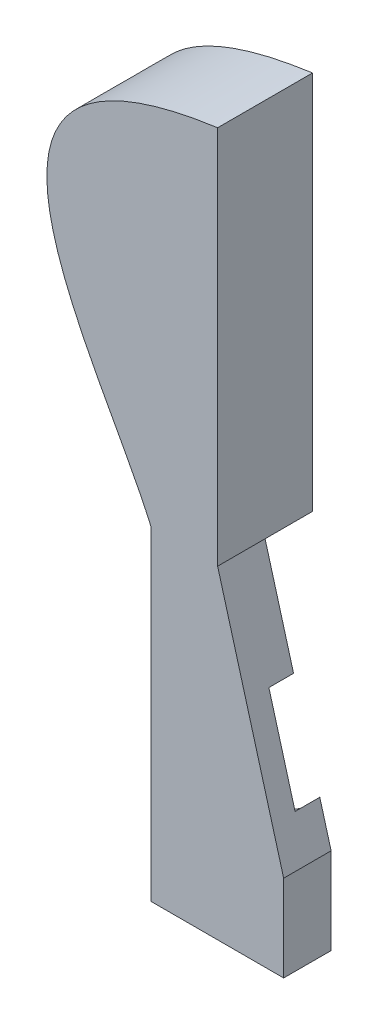
ISO-10303-21;
HEADER;
FILE_DESCRIPTION(('STEP AP214'),'2;1');
FILE_NAME('part.step','',(''),(''),'','','');
FILE_SCHEMA(('AUTOMOTIVE_DESIGN { 1 0 10303 214 1 1 1 1 }'));
ENDSEC;
DATA;
#1=APPLICATION_CONTEXT('core data for automotive mechanical design processes');
#2=APPLICATION_PROTOCOL_DEFINITION('international standard','automotive_design',2000,#1);
#3=PRODUCT_CONTEXT('',#1,'mechanical');
#4=PRODUCT('Part','Part','',(#3));
#5=PRODUCT_RELATED_PRODUCT_CATEGORY('part','',(#4));
#6=PRODUCT_DEFINITION_FORMATION('','',#4);
#7=PRODUCT_DEFINITION_CONTEXT('part definition',#1,'design');
#8=PRODUCT_DEFINITION('design','',#6,#7);
#9=PRODUCT_DEFINITION_SHAPE('','',#8);
#10=(LENGTH_UNIT() NAMED_UNIT(*) SI_UNIT(.MILLI.,.METRE.));
#11=(NAMED_UNIT(*) PLANE_ANGLE_UNIT() SI_UNIT($,.RADIAN.));
#12=(NAMED_UNIT(*) SI_UNIT($,.STERADIAN.) SOLID_ANGLE_UNIT());
#13=UNCERTAINTY_MEASURE_WITH_UNIT(LENGTH_MEASURE(1.E-05),#10,'distance_accuracy_value','');
#14=(GEOMETRIC_REPRESENTATION_CONTEXT(3) GLOBAL_UNCERTAINTY_ASSIGNED_CONTEXT((#13)) GLOBAL_UNIT_ASSIGNED_CONTEXT((#10,
#11,#12)) REPRESENTATION_CONTEXT('',''));
#15=CARTESIAN_POINT('',(0.,0.,0.));
#16=DIRECTION('',(0.,0.,1.));
#17=DIRECTION('',(1.,0.,0.));
#18=AXIS2_PLACEMENT_3D('',#15,#16,#17);
#19=CARTESIAN_POINT('',(0.220726200140617,284.828286352385,50.));
#20=CARTESIAN_POINT('',(-159.978737061135,262.606607754272,50.));
#21=CARTESIAN_POINT('',(-63.0007246030179,150.139017080568,50.));
#22=CARTESIAN_POINT('',(-35.,85.6249999999999,50.));
#23=B_SPLINE_CURVE_WITH_KNOTS('',3,(#19,#20,#21,#22),.UNSPECIFIED.,.F.,.F.,(4,4),(0.,1.),.UNSPECIFIED.);
#24=DIRECTION('',(0.,0.,-1.));
#25=VECTOR('',#24,1.);
#26=SURFACE_OF_LINEAR_EXTRUSION('',#23,#25);
#27=CARTESIAN_POINT('',(0.220726200140617,284.828286352385,0.));
#28=CARTESIAN_POINT('',(-159.978737061135,262.606607754272,0.));
#29=CARTESIAN_POINT('',(-63.0007246030179,150.139017080568,0.));
#30=CARTESIAN_POINT('',(-35.,85.6249999999999,0.));
#31=B_SPLINE_CURVE_WITH_KNOTS('',3,(#27,#28,#29,#30),.UNSPECIFIED.,.F.,.F.,(4,4),(0.,1.),.UNSPECIFIED.);
#32=CARTESIAN_POINT('',(0.220726200140617,284.828286352385,0.));
#33=VERTEX_POINT('',#32);
#34=CARTESIAN_POINT('',(-35.,85.6249999999999,0.));
#35=VERTEX_POINT('',#34);
#36=EDGE_CURVE('E140',#33,#35,#31,.T.);
#37=ORIENTED_EDGE('',*,*,#36,.T.);
#38=DIRECTION('',(0.,0.,-1.));
#39=VECTOR('',#38,1.);
#40=CARTESIAN_POINT('',(-35.,85.6249999999999,50.));
#41=LINE('',#40,#39);
#42=CARTESIAN_POINT('',(-35.,85.6249999999999,50.));
#43=VERTEX_POINT('',#42);
#44=EDGE_CURVE('E186',#43,#35,#41,.T.);
#45=ORIENTED_EDGE('',*,*,#44,.F.);
#46=CARTESIAN_POINT('',(0.220726200140617,284.828286352385,50.));
#47=VERTEX_POINT('',#46);
#48=EDGE_CURVE('E141',#47,#43,#23,.T.);
#49=ORIENTED_EDGE('',*,*,#48,.F.);
#50=DIRECTION('',(0.,0.,-1.));
#51=VECTOR('',#50,1.);
#52=CARTESIAN_POINT('',(0.220726200140617,284.828286352385,50.));
#53=LINE('',#52,#51);
#54=EDGE_CURVE('E161',#47,#33,#53,.T.);
#55=ORIENTED_EDGE('',*,*,#54,.T.);
#56=EDGE_LOOP('',(#37,#45,#49,#55));
#57=FACE_BOUND('',#56,.T.);
#58=ADVANCED_FACE('F33',(#57),#26,.F.);
#59=CARTESIAN_POINT('',(-35.,-85.6249999999999,50.));
#60=DIRECTION('',(1.,0.,0.));
#61=DIRECTION('',(0.,0.,-1.));
#62=AXIS2_PLACEMENT_3D('',#59,#60,#61);
#63=PLANE('',#62);
#64=DIRECTION('',(0.,0.,1.));
#65=VECTOR('',#64,1.);
#66=CARTESIAN_POINT('',(-35.,75.0232065963302,50.));
#67=LINE('',#66,#65);
#68=CARTESIAN_POINT('',(-35.,75.0232065963301,0.));
#69=VERTEX_POINT('',#68);
#70=CARTESIAN_POINT('',(-35.,75.0232065963302,25.));
#71=VERTEX_POINT('',#70);
#72=EDGE_CURVE('E56',#69,#71,#67,.T.);
#73=ORIENTED_EDGE('',*,*,#72,.T.);
#74=DIRECTION('',(0.,-1.,0.));
#75=VECTOR('',#74,1.);
#76=CARTESIAN_POINT('',(-35.,-85.6249999999999,25.));
#77=LINE('',#76,#75);
#78=CARTESIAN_POINT('',(-35.,-85.6249999999999,25.));
#79=VERTEX_POINT('',#78);
#80=EDGE_CURVE('E138',#71,#79,#77,.T.);
#81=ORIENTED_EDGE('',*,*,#80,.T.);
#82=DIRECTION('',(0.,0.,-1.));
#83=VECTOR('',#82,1.);
#84=CARTESIAN_POINT('',(-35.,-85.6249999999999,50.));
#85=LINE('',#84,#83);
#86=CARTESIAN_POINT('',(-35.,-85.6249999999999,50.));
#87=VERTEX_POINT('',#86);
#88=EDGE_CURVE('E183',#87,#79,#85,.T.);
#89=ORIENTED_EDGE('',*,*,#88,.F.);
#90=DIRECTION('',(0.,-1.,0.));
#91=VECTOR('',#90,1.);
#92=CARTESIAN_POINT('',(-35.,-85.6249999999999,50.));
#93=LINE('',#92,#91);
#94=EDGE_CURVE('E147',#43,#87,#93,.T.);
#95=ORIENTED_EDGE('',*,*,#94,.F.);
#96=ORIENTED_EDGE('',*,*,#44,.T.);
#97=DIRECTION('',(0.,-1.,0.));
#98=VECTOR('',#97,1.);
#99=CARTESIAN_POINT('',(-35.,-85.6249999999999,0.));
#100=LINE('',#99,#98);
#101=EDGE_CURVE('E166',#35,#69,#100,.T.);
#102=ORIENTED_EDGE('',*,*,#101,.T.);
#103=EDGE_LOOP('',(#73,#81,#89,#95,#96,#102));
#104=FACE_BOUND('',#103,.T.);
#105=ADVANCED_FACE('F214',(#104),#63,.F.);
#106=CARTESIAN_POINT('',(35.,-85.6249999999999,50.));
#107=DIRECTION('',(0.,1.,0.));
#108=DIRECTION('',(0.,0.,1.));
#109=AXIS2_PLACEMENT_3D('',#106,#107,#108);
#110=PLANE('',#109);
#111=ORIENTED_EDGE('',*,*,#88,.T.);
#112=DIRECTION('',(1.,0.,0.));
#113=VECTOR('',#112,1.);
#114=CARTESIAN_POINT('',(35.,-85.6249999999999,25.));
#115=LINE('',#114,#113);
#116=CARTESIAN_POINT('',(35.,-85.6249999999999,25.));
#117=VERTEX_POINT('',#116);
#118=EDGE_CURVE('E135',#79,#117,#115,.T.);
#119=ORIENTED_EDGE('',*,*,#118,.T.);
#120=DIRECTION('',(0.,0.,-1.));
#121=VECTOR('',#120,1.);
#122=CARTESIAN_POINT('',(35.,-85.6249999999999,50.));
#123=LINE('',#122,#121);
#124=CARTESIAN_POINT('',(35.,-85.6249999999999,50.));
#125=VERTEX_POINT('',#124);
#126=EDGE_CURVE('E180',#125,#117,#123,.T.);
#127=ORIENTED_EDGE('',*,*,#126,.F.);
#128=DIRECTION('',(1.,0.,0.));
#129=VECTOR('',#128,1.);
#130=CARTESIAN_POINT('',(35.,-85.6249999999999,50.));
#131=LINE('',#130,#129);
#132=EDGE_CURVE('E153',#87,#125,#131,.T.);
#133=ORIENTED_EDGE('',*,*,#132,.F.);
#134=EDGE_LOOP('',(#111,#119,#127,#133));
#135=FACE_BOUND('',#134,.T.);
#136=ADVANCED_FACE('F210',(#135),#110,.F.);
#137=CARTESIAN_POINT('',(35.,-40.1019375,50.));
#138=DIRECTION('',(-1.,0.,0.));
#139=DIRECTION('',(0.,0.,1.));
#140=AXIS2_PLACEMENT_3D('',#137,#138,#139);
#141=PLANE('',#140);
#142=ORIENTED_EDGE('',*,*,#126,.T.);
#143=DIRECTION('',(0.,1.,0.));
#144=VECTOR('',#143,1.);
#145=CARTESIAN_POINT('',(35.,-40.1019375,25.));
#146=LINE('',#145,#144);
#147=CARTESIAN_POINT('',(35.,-40.1019375,25.));
#148=VERTEX_POINT('',#147);
#149=EDGE_CURVE('E132',#117,#148,#146,.T.);
#150=ORIENTED_EDGE('',*,*,#149,.T.);
#151=DIRECTION('',(0.,0.,-1.));
#152=VECTOR('',#151,1.);
#153=CARTESIAN_POINT('',(35.,-40.1019375,50.));
#154=LINE('',#153,#152);
#155=CARTESIAN_POINT('',(35.,-40.1019375,50.));
#156=VERTEX_POINT('',#155);
#157=EDGE_CURVE('E178',#156,#148,#154,.T.);
#158=ORIENTED_EDGE('',*,*,#157,.F.);
#159=DIRECTION('',(0.,1.,0.));
#160=VECTOR('',#159,1.);
#161=CARTESIAN_POINT('',(35.,-40.1019375,50.));
#162=LINE('',#161,#160);
#163=EDGE_CURVE('E155',#125,#156,#162,.T.);
#164=ORIENTED_EDGE('',*,*,#163,.F.);
#165=EDGE_LOOP('',(#142,#150,#158,#164));
#166=FACE_BOUND('',#165,.T.);
#167=ADVANCED_FACE('F207',(#166),#141,.F.);
#168=CARTESIAN_POINT('',(0.221790000790527,84.8282863552137,50.));
#169=DIRECTION('',(-0.963367879663412,-0.268183385825488,0.));
#170=DIRECTION('',(0.268183385825488,-0.963367879663412,0.));
#171=AXIS2_PLACEMENT_3D('',#168,#169,#170);
#172=PLANE('',#171);
#173=DIRECTION('',(0.268183385825488,-0.963367879663412,0.));
#174=VECTOR('',#173,1.);
#175=CARTESIAN_POINT('',(0.221790000790527,84.8282863552137,38.));
#176=LINE('',#175,#174);
#177=CARTESIAN_POINT('',(15.2169204209926,30.9628056367827,38.));
#178=VERTEX_POINT('',#177);
#179=CARTESIAN_POINT('',(29.0271028135332,-18.6461068926618,38.));
#180=VERTEX_POINT('',#179);
#181=EDGE_CURVE('E11',#178,#180,#176,.T.);
#182=ORIENTED_EDGE('',*,*,#181,.F.);
#183=DIRECTION('',(0.,0.,-1.));
#184=VECTOR('',#183,1.);
#185=CARTESIAN_POINT('',(15.2169204209926,30.9628056367826,38.));
#186=LINE('',#185,#184);
#187=CARTESIAN_POINT('',(15.2169204209926,30.9628056367826,25.));
#188=VERTEX_POINT('',#187);
#189=EDGE_CURVE('E106',#178,#188,#186,.T.);
#190=ORIENTED_EDGE('',*,*,#189,.T.);
#191=DIRECTION('',(0.268183385825487,-0.963367879663412,0.));
#192=VECTOR('',#191,1.);
#193=CARTESIAN_POINT('',(0.221790000790537,84.8282863552137,25.));
#194=LINE('',#193,#192);
#195=CARTESIAN_POINT('',(0.221790000790537,84.8282863552137,25.));
#196=VERTEX_POINT('',#195);
#197=EDGE_CURVE('E127',#196,#188,#194,.T.);
#198=ORIENTED_EDGE('',*,*,#197,.F.);
#199=DIRECTION('',(0.,0.,-1.));
#200=VECTOR('',#199,1.);
#201=CARTESIAN_POINT('',(0.221790000790527,84.8282863552137,50.));
#202=LINE('',#201,#200);
#203=CARTESIAN_POINT('',(0.221790000790527,84.8282863552137,50.));
#204=VERTEX_POINT('',#203);
#205=EDGE_CURVE('E175',#204,#196,#202,.T.);
#206=ORIENTED_EDGE('',*,*,#205,.F.);
#207=DIRECTION('',(-0.268183385825488,0.963367879663412,0.));
#208=VECTOR('',#207,1.);
#209=CARTESIAN_POINT('',(0.221790000790527,84.8282863552137,50.));
#210=LINE('',#209,#208);
#211=EDGE_CURVE('E157',#156,#204,#210,.T.);
#212=ORIENTED_EDGE('',*,*,#211,.F.);
#213=ORIENTED_EDGE('',*,*,#157,.T.);
#214=CARTESIAN_POINT('',(29.0271028135332,-18.6461068926618,25.));
#215=VERTEX_POINT('',#214);
#216=EDGE_CURVE('E122',#215,#148,#194,.T.);
#217=ORIENTED_EDGE('',*,*,#216,.F.);
#218=DIRECTION('',(0.,0.,-1.));
#219=VECTOR('',#218,1.);
#220=CARTESIAN_POINT('',(29.0271028135332,-18.6461068926618,38.));
#221=LINE('',#220,#219);
#222=EDGE_CURVE('E48',#215,#180,#221,.F.);
#223=ORIENTED_EDGE('',*,*,#222,.T.);
#224=EDGE_LOOP('',(#182,#190,#198,#206,#212,#213,#217,#223));
#225=FACE_BOUND('',#224,.T.);
#226=ADVANCED_FACE('F119',(#225),#172,.F.);
#227=CARTESIAN_POINT('',(0.221790000790527,84.8282863552137,50.));
#228=DIRECTION('',(-0.999999999985854,-5.31900324955009E-06,0.));
#229=DIRECTION('',(5.31900324955009E-06,-0.999999999985854,0.));
#230=AXIS2_PLACEMENT_3D('',#227,#228,#229);
#231=PLANE('',#230);
#232=DIRECTION('',(-5.31900324955009E-06,0.999999999985854,0.));
#233=VECTOR('',#232,1.);
#234=CARTESIAN_POINT('',(0.221790000790527,84.8282863552137,0.));
#235=LINE('',#234,#233);
#236=CARTESIAN_POINT('',(0.221790000790537,84.8282863552137,0.));
#237=VERTEX_POINT('',#236);
#238=EDGE_CURVE('E148',#237,#33,#235,.T.);
#239=ORIENTED_EDGE('',*,*,#238,.T.);
#240=ORIENTED_EDGE('',*,*,#54,.F.);
#241=DIRECTION('',(-5.31900324955009E-06,0.999999999985854,0.));
#242=VECTOR('',#241,1.);
#243=CARTESIAN_POINT('',(0.221790000790527,84.8282863552137,50.));
#244=LINE('',#243,#242);
#245=EDGE_CURVE('E159',#204,#47,#244,.T.);
#246=ORIENTED_EDGE('',*,*,#245,.F.);
#247=ORIENTED_EDGE('',*,*,#205,.T.);
#248=DIRECTION('',(0.,0.,1.));
#249=VECTOR('',#248,1.);
#250=CARTESIAN_POINT('',(0.221790000790537,84.8282863552137,-41.3763691391845));
#251=LINE('',#250,#249);
#252=EDGE_CURVE('E114',#237,#196,#251,.T.);
#253=ORIENTED_EDGE('',*,*,#252,.F.);
#254=EDGE_LOOP('',(#239,#240,#246,#247,#253));
#255=FACE_BOUND('',#254,.T.);
#256=ADVANCED_FACE('F197',(#255),#231,.F.);
#257=CARTESIAN_POINT('',(-87.9647073490397,201.086270107113,50.));
#258=DIRECTION('',(0.,0.,-1.));
#259=DIRECTION('',(-1.,0.,0.));
#260=AXIS2_PLACEMENT_3D('',#257,#258,#259);
#261=PLANE('',#260);
#262=ORIENTED_EDGE('',*,*,#48,.T.);
#263=ORIENTED_EDGE('',*,*,#94,.T.);
#264=ORIENTED_EDGE('',*,*,#132,.T.);
#265=ORIENTED_EDGE('',*,*,#163,.T.);
#266=ORIENTED_EDGE('',*,*,#211,.T.);
#267=ORIENTED_EDGE('',*,*,#245,.T.);
#268=EDGE_LOOP('',(#262,#263,#264,#265,#266,#267));
#269=FACE_BOUND('',#268,.T.);
#270=ADVANCED_FACE('F202',(#269),#261,.F.);
#271=CARTESIAN_POINT('',(-87.9647073490397,201.086270107113,0.));
#272=DIRECTION('',(0.,0.,-1.));
#273=DIRECTION('',(-1.,0.,0.));
#274=AXIS2_PLACEMENT_3D('',#271,#272,#273);
#275=PLANE('',#274);
#276=DIRECTION('',(0.963367879663412,0.268183385825488,0.));
#277=VECTOR('',#276,1.);
#278=CARTESIAN_POINT('',(-51.5858024995493,70.4060330691039,0.));
#279=LINE('',#278,#277);
#280=EDGE_CURVE('E189',#69,#237,#279,.T.);
#281=ORIENTED_EDGE('',*,*,#280,.F.);
#282=ORIENTED_EDGE('',*,*,#101,.F.);
#283=ORIENTED_EDGE('',*,*,#36,.F.);
#284=ORIENTED_EDGE('',*,*,#238,.F.);
#285=EDGE_LOOP('',(#281,#282,#283,#284));
#286=FACE_BOUND('',#285,.T.);
#287=ADVANCED_FACE('F217',(#286),#275,.T.);
#288=CARTESIAN_POINT('',(-132.824758814397,47.7906450897407,25.));
#289=DIRECTION('',(0.,0.,1.));
#290=DIRECTION('',(1.,0.,0.));
#291=AXIS2_PLACEMENT_3D('',#288,#289,#290);
#292=PLANE('',#291);
#293=ORIENTED_EDGE('',*,*,#197,.T.);
#294=CARTESIAN_POINT('',(0.,0.,25.));
#295=DIRECTION('',(0.,0.,1.));
#296=DIRECTION('',(1.,0.,0.));
#297=AXIS2_PLACEMENT_3D('',#294,#295,#296);
#298=CIRCLE('',#297,34.5);
#299=EDGE_CURVE('E41',#188,#215,#298,.T.);
#300=ORIENTED_EDGE('',*,*,#299,.T.);
#301=ORIENTED_EDGE('',*,*,#216,.T.);
#302=ORIENTED_EDGE('',*,*,#149,.F.);
#303=ORIENTED_EDGE('',*,*,#118,.F.);
#304=ORIENTED_EDGE('',*,*,#80,.F.);
#305=DIRECTION('',(0.963367879663412,0.268183385825488,0.));
#306=VECTOR('',#305,1.);
#307=CARTESIAN_POINT('',(-132.824758814397,47.7906450897407,25.));
#308=LINE('',#307,#306);
#309=EDGE_CURVE('E129',#71,#196,#308,.T.);
#310=ORIENTED_EDGE('',*,*,#309,.T.);
#311=EDGE_LOOP('',(#293,#300,#301,#302,#303,#304,#310));
#312=FACE_BOUND('',#311,.T.);
#313=ADVANCED_FACE('F191',(#312),#292,.F.);
#314=CARTESIAN_POINT('',(-132.824758814397,47.7906450897407,-41.3763691391845));
#315=DIRECTION('',(-0.268183385825488,0.963367879663412,0.));
#316=DIRECTION('',(-0.963367879663412,-0.268183385825488,0.));
#317=AXIS2_PLACEMENT_3D('',#314,#315,#316);
#318=PLANE('',#317);
#319=ORIENTED_EDGE('',*,*,#280,.T.);
#320=ORIENTED_EDGE('',*,*,#252,.T.);
#321=ORIENTED_EDGE('',*,*,#309,.F.);
#322=ORIENTED_EDGE('',*,*,#72,.F.);
#323=EDGE_LOOP('',(#319,#320,#321,#322));
#324=FACE_BOUND('',#323,.T.);
#325=ADVANCED_FACE('F215',(#324),#318,.F.);
#326=CARTESIAN_POINT('',(0.,0.,38.));
#327=DIRECTION('',(0.,0.,-1.));
#328=DIRECTION('',(-1.,0.,0.));
#329=AXIS2_PLACEMENT_3D('',#326,#327,#328);
#330=PLANE('',#329);
#331=ORIENTED_EDGE('',*,*,#181,.T.);
#332=CARTESIAN_POINT('',(0.,0.,38.));
#333=DIRECTION('',(0.,0.,-1.));
#334=DIRECTION('',(-1.,0.,0.));
#335=AXIS2_PLACEMENT_3D('',#332,#333,#334);
#336=CIRCLE('',#335,34.5);
#337=EDGE_CURVE('E109',#180,#178,#336,.T.);
#338=ORIENTED_EDGE('',*,*,#337,.T.);
#339=EDGE_LOOP('',(#331,#338));
#340=FACE_BOUND('',#339,.T.);
#341=ADVANCED_FACE('F117',(#340),#330,.T.);
#342=CARTESIAN_POINT('',(0.,0.,38.));
#343=DIRECTION('',(0.,0.,-1.));
#344=DIRECTION('',(-1.,0.,0.));
#345=AXIS2_PLACEMENT_3D('',#342,#343,#344);
#346=CYLINDRICAL_SURFACE('',#345,34.5);
#347=ORIENTED_EDGE('',*,*,#337,.F.);
#348=ORIENTED_EDGE('',*,*,#222,.F.);
#349=ORIENTED_EDGE('',*,*,#299,.F.);
#350=ORIENTED_EDGE('',*,*,#189,.F.);
#351=EDGE_LOOP('',(#347,#348,#349,#350));
#352=FACE_BOUND('',#351,.T.);
#353=ADVANCED_FACE('F108',(#352),#346,.F.);
#354=CLOSED_SHELL('',(#58,#105,#136,#167,#226,#256,#270,#287,#313,#325,#341,#353));
#355=MANIFOLD_SOLID_BREP('B2',#354);
#356=ADVANCED_BREP_SHAPE_REPRESENTATION('',(#18,#355),#14);
#357=SHAPE_DEFINITION_REPRESENTATION(#9,#356);
ENDSEC;
END-ISO-10303-21;
